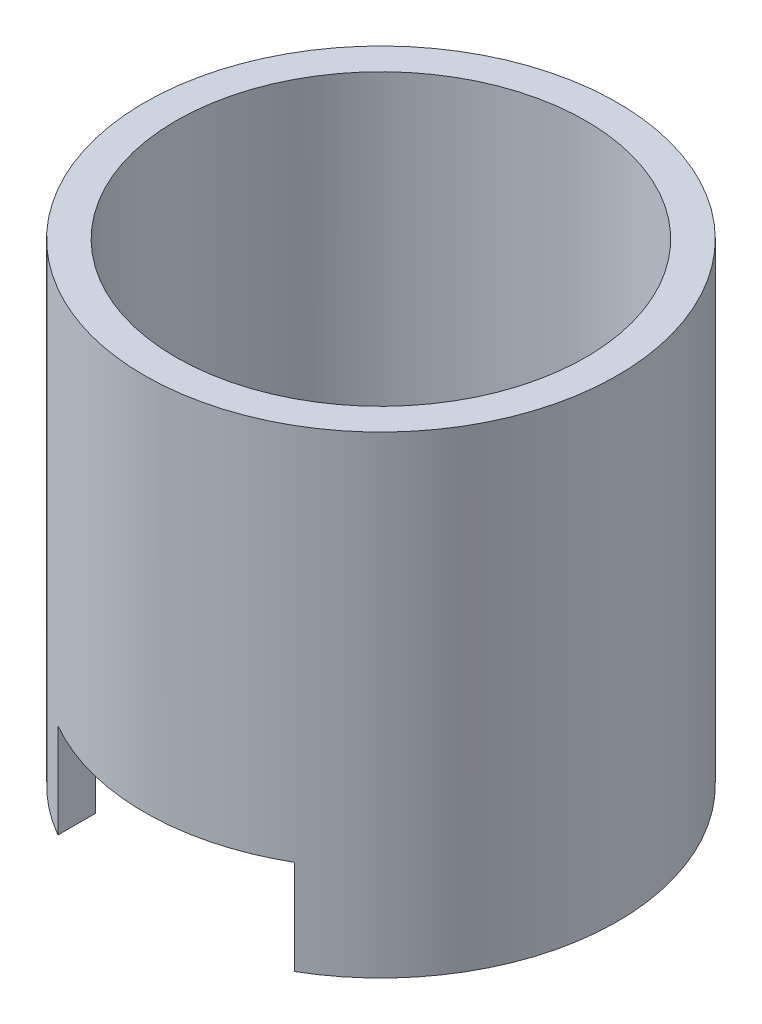
ISO-10303-21;
HEADER;
FILE_DESCRIPTION(('STEP AP214'),'2;1');
FILE_NAME('part.step','',(''),(''),'','','');
FILE_SCHEMA(('AUTOMOTIVE_DESIGN { 1 0 10303 214 1 1 1 1 }'));
ENDSEC;
DATA;
#1=APPLICATION_CONTEXT('core data for automotive mechanical design processes');
#2=APPLICATION_PROTOCOL_DEFINITION('international standard','automotive_design',2000,#1);
#3=PRODUCT_CONTEXT('',#1,'mechanical');
#4=PRODUCT('Part','Part','',(#3));
#5=PRODUCT_RELATED_PRODUCT_CATEGORY('part','',(#4));
#6=PRODUCT_DEFINITION_FORMATION('','',#4);
#7=PRODUCT_DEFINITION_CONTEXT('part definition',#1,'design');
#8=PRODUCT_DEFINITION('design','',#6,#7);
#9=PRODUCT_DEFINITION_SHAPE('','',#8);
#10=(LENGTH_UNIT() NAMED_UNIT(*) SI_UNIT(.MILLI.,.METRE.));
#11=(NAMED_UNIT(*) PLANE_ANGLE_UNIT() SI_UNIT($,.RADIAN.));
#12=(NAMED_UNIT(*) SI_UNIT($,.STERADIAN.) SOLID_ANGLE_UNIT());
#13=UNCERTAINTY_MEASURE_WITH_UNIT(LENGTH_MEASURE(1.E-05),#10,'distance_accuracy_value','');
#14=(GEOMETRIC_REPRESENTATION_CONTEXT(3) GLOBAL_UNCERTAINTY_ASSIGNED_CONTEXT((#13)) GLOBAL_UNIT_ASSIGNED_CONTEXT((#10,
#11,#12)) REPRESENTATION_CONTEXT('',''));
#15=CARTESIAN_POINT('',(0.,0.,0.));
#16=DIRECTION('',(0.,0.,1.));
#17=DIRECTION('',(1.,0.,0.));
#18=AXIS2_PLACEMENT_3D('',#15,#16,#17);
#19=CARTESIAN_POINT('',(0.,0.,0.));
#20=DIRECTION('',(0.,1.,0.));
#21=DIRECTION('',(0.,0.,1.));
#22=AXIS2_PLACEMENT_3D('',#19,#20,#21);
#23=PLANE('',#22);
#24=DIRECTION('',(0.,0.,-1.));
#25=VECTOR('',#24,1.);
#26=CARTESIAN_POINT('',(-75.,0.,180.));
#27=LINE('',#26,#25);
#28=CARTESIAN_POINT('',(-75.,0.,129.903810567666));
#29=VERTEX_POINT('',#28);
#30=CARTESIAN_POINT('',(-75.,0.,106.183802907977));
#31=VERTEX_POINT('',#30);
#32=EDGE_CURVE('E55',#29,#31,#27,.T.);
#33=ORIENTED_EDGE('',*,*,#32,.F.);
#34=CARTESIAN_POINT('',(0.,0.,0.));
#35=DIRECTION('',(0.,1.,0.));
#36=DIRECTION('',(0.,0.,1.));
#37=AXIS2_PLACEMENT_3D('',#34,#35,#36);
#38=CIRCLE('',#37,150.);
#39=CARTESIAN_POINT('',(75.,0.,129.903810567666));
#40=VERTEX_POINT('',#39);
#41=EDGE_CURVE('E87',#40,#29,#38,.T.);
#42=ORIENTED_EDGE('',*,*,#41,.F.);
#43=DIRECTION('',(0.,0.,-1.));
#44=VECTOR('',#43,1.);
#45=CARTESIAN_POINT('',(75.,0.,180.));
#46=LINE('',#45,#44);
#47=CARTESIAN_POINT('',(75.,0.,106.183802907977));
#48=VERTEX_POINT('',#47);
#49=EDGE_CURVE('E109',#40,#48,#46,.T.);
#50=ORIENTED_EDGE('',*,*,#49,.T.);
#51=CARTESIAN_POINT('',(0.,0.,0.));
#52=DIRECTION('',(0.,1.,0.));
#53=DIRECTION('',(0.,0.,1.));
#54=AXIS2_PLACEMENT_3D('',#51,#52,#53);
#55=CIRCLE('',#54,130.);
#56=EDGE_CURVE('E88',#48,#31,#55,.T.);
#57=ORIENTED_EDGE('',*,*,#56,.T.);
#58=EDGE_LOOP('',(#33,#42,#50,#57));
#59=FACE_BOUND('',#58,.T.);
#60=ADVANCED_FACE('F33',(#59),#23,.F.);
#61=CARTESIAN_POINT('',(0.,300.,0.));
#62=DIRECTION('',(0.,-1.,0.));
#63=DIRECTION('',(0.,0.,-1.));
#64=AXIS2_PLACEMENT_3D('',#61,#62,#63);
#65=CYLINDRICAL_SURFACE('',#64,150.);
#66=CARTESIAN_POINT('',(0.,300.,0.));
#67=DIRECTION('',(0.,1.,0.));
#68=DIRECTION('',(0.,0.,1.));
#69=AXIS2_PLACEMENT_3D('',#66,#67,#68);
#70=CIRCLE('',#69,150.);
#71=CARTESIAN_POINT('',(0.,300.,150.));
#72=VERTEX_POINT('',#71);
#73=EDGE_CURVE('E97',#72,#72,#70,.T.);
#74=ORIENTED_EDGE('',*,*,#73,.F.);
#75=EDGE_LOOP('',(#74));
#76=FACE_BOUND('',#75,.T.);
#77=DIRECTION('',(0.,-1.,0.));
#78=VECTOR('',#77,1.);
#79=CARTESIAN_POINT('',(-75.,300.,129.903810567666));
#80=LINE('',#79,#78);
#81=CARTESIAN_POINT('',(-75.,60.,129.903810567666));
#82=VERTEX_POINT('',#81);
#83=EDGE_CURVE('E82',#82,#29,#80,.T.);
#84=ORIENTED_EDGE('',*,*,#83,.F.);
#85=CARTESIAN_POINT('',(0.,60.,0.));
#86=DIRECTION('',(0.,-1.,0.));
#87=DIRECTION('',(1.,0.,0.));
#88=AXIS2_PLACEMENT_3D('',#85,#86,#87);
#89=CIRCLE('',#88,150.);
#90=CARTESIAN_POINT('',(75.,60.,129.903810567666));
#91=VERTEX_POINT('',#90);
#92=EDGE_CURVE('E72',#91,#82,#89,.T.);
#93=ORIENTED_EDGE('',*,*,#92,.F.);
#94=DIRECTION('',(0.,-1.,0.));
#95=VECTOR('',#94,1.);
#96=CARTESIAN_POINT('',(74.9999999999999,300.,129.903810567666));
#97=LINE('',#96,#95);
#98=EDGE_CURVE('E79',#40,#91,#97,.F.);
#99=ORIENTED_EDGE('',*,*,#98,.F.);
#100=ORIENTED_EDGE('',*,*,#41,.T.);
#101=EDGE_LOOP('',(#84,#93,#99,#100));
#102=FACE_BOUND('',#101,.T.);
#103=ADVANCED_FACE('F35',(#76,#102),#65,.T.);
#104=CARTESIAN_POINT('',(0.,300.,0.));
#105=DIRECTION('',(0.,-1.,0.));
#106=DIRECTION('',(0.,0.,-1.));
#107=AXIS2_PLACEMENT_3D('',#104,#105,#106);
#108=CYLINDRICAL_SURFACE('',#107,130.);
#109=CARTESIAN_POINT('',(0.,300.,0.));
#110=DIRECTION('',(0.,1.,0.));
#111=DIRECTION('',(0.,0.,1.));
#112=AXIS2_PLACEMENT_3D('',#109,#110,#111);
#113=CIRCLE('',#112,130.);
#114=CARTESIAN_POINT('',(0.,300.,130.));
#115=VERTEX_POINT('',#114);
#116=EDGE_CURVE('E91',#115,#115,#113,.T.);
#117=ORIENTED_EDGE('',*,*,#116,.T.);
#118=EDGE_LOOP('',(#117));
#119=FACE_BOUND('',#118,.T.);
#120=CARTESIAN_POINT('',(0.,60.,0.));
#121=DIRECTION('',(0.,-1.,0.));
#122=DIRECTION('',(1.,0.,0.));
#123=AXIS2_PLACEMENT_3D('',#120,#121,#122);
#124=CIRCLE('',#123,130.);
#125=CARTESIAN_POINT('',(75.,60.,106.183802907977));
#126=VERTEX_POINT('',#125);
#127=CARTESIAN_POINT('',(-75.,60.,106.183802907977));
#128=VERTEX_POINT('',#127);
#129=EDGE_CURVE('E100',#126,#128,#124,.T.);
#130=ORIENTED_EDGE('',*,*,#129,.T.);
#131=DIRECTION('',(0.,-1.,0.));
#132=VECTOR('',#131,1.);
#133=CARTESIAN_POINT('',(-75.,300.,106.183802907977));
#134=LINE('',#133,#132);
#135=EDGE_CURVE('E11',#128,#31,#134,.T.);
#136=ORIENTED_EDGE('',*,*,#135,.T.);
#137=ORIENTED_EDGE('',*,*,#56,.F.);
#138=DIRECTION('',(0.,-1.,0.));
#139=VECTOR('',#138,1.);
#140=CARTESIAN_POINT('',(74.9999999999999,300.,106.183802907977));
#141=LINE('',#140,#139);
#142=EDGE_CURVE('E41',#48,#126,#141,.F.);
#143=ORIENTED_EDGE('',*,*,#142,.T.);
#144=EDGE_LOOP('',(#130,#136,#137,#143));
#145=FACE_BOUND('',#144,.T.);
#146=ADVANCED_FACE('F105',(#119,#145),#108,.F.);
#147=CARTESIAN_POINT('',(0.,300.,0.));
#148=DIRECTION('',(0.,1.,0.));
#149=DIRECTION('',(0.,0.,1.));
#150=AXIS2_PLACEMENT_3D('',#147,#148,#149);
#151=PLANE('',#150);
#152=ORIENTED_EDGE('',*,*,#73,.T.);
#153=EDGE_LOOP('',(#152));
#154=FACE_BOUND('',#153,.T.);
#155=ORIENTED_EDGE('',*,*,#116,.F.);
#156=EDGE_LOOP('',(#155));
#157=FACE_BOUND('',#156,.T.);
#158=ADVANCED_FACE('F121',(#154,#157),#151,.T.);
#159=CARTESIAN_POINT('',(-75.,0.,180.));
#160=DIRECTION('',(1.,0.,0.));
#161=DIRECTION('',(0.,0.,-1.));
#162=AXIS2_PLACEMENT_3D('',#159,#160,#161);
#163=PLANE('',#162);
#164=ORIENTED_EDGE('',*,*,#83,.T.);
#165=ORIENTED_EDGE('',*,*,#32,.T.);
#166=ORIENTED_EDGE('',*,*,#135,.F.);
#167=DIRECTION('',(0.,0.,-1.));
#168=VECTOR('',#167,1.);
#169=CARTESIAN_POINT('',(-75.,60.,180.));
#170=LINE('',#169,#168);
#171=EDGE_CURVE('E48',#82,#128,#170,.T.);
#172=ORIENTED_EDGE('',*,*,#171,.F.);
#173=EDGE_LOOP('',(#164,#165,#166,#172));
#174=FACE_BOUND('',#173,.T.);
#175=ADVANCED_FACE('F81',(#174),#163,.T.);
#176=CARTESIAN_POINT('',(75.,0.,180.));
#177=DIRECTION('',(-1.,0.,0.));
#178=DIRECTION('',(0.,-1.,0.));
#179=AXIS2_PLACEMENT_3D('',#176,#177,#178);
#180=PLANE('',#179);
#181=ORIENTED_EDGE('',*,*,#98,.T.);
#182=DIRECTION('',(0.,0.,-1.));
#183=VECTOR('',#182,1.);
#184=CARTESIAN_POINT('',(75.,60.,180.));
#185=LINE('',#184,#183);
#186=EDGE_CURVE('E75',#91,#126,#185,.T.);
#187=ORIENTED_EDGE('',*,*,#186,.T.);
#188=ORIENTED_EDGE('',*,*,#142,.F.);
#189=ORIENTED_EDGE('',*,*,#49,.F.);
#190=EDGE_LOOP('',(#181,#187,#188,#189));
#191=FACE_BOUND('',#190,.T.);
#192=ADVANCED_FACE('F108',(#191),#180,.T.);
#193=CARTESIAN_POINT('',(0.,60.,180.));
#194=DIRECTION('',(0.,-1.,0.));
#195=DIRECTION('',(1.,0.,0.));
#196=AXIS2_PLACEMENT_3D('',#193,#194,#195);
#197=PLANE('',#196);
#198=ORIENTED_EDGE('',*,*,#92,.T.);
#199=ORIENTED_EDGE('',*,*,#171,.T.);
#200=ORIENTED_EDGE('',*,*,#129,.F.);
#201=ORIENTED_EDGE('',*,*,#186,.F.);
#202=EDGE_LOOP('',(#198,#199,#200,#201));
#203=FACE_BOUND('',#202,.T.);
#204=ADVANCED_FACE('F73',(#203),#197,.T.);
#205=CLOSED_SHELL('',(#60,#103,#146,#158,#175,#192,#204));
#206=MANIFOLD_SOLID_BREP('B2',#205);
#207=ADVANCED_BREP_SHAPE_REPRESENTATION('',(#18,#206),#14);
#208=SHAPE_DEFINITION_REPRESENTATION(#9,#207);
ENDSEC;
END-ISO-10303-21;
